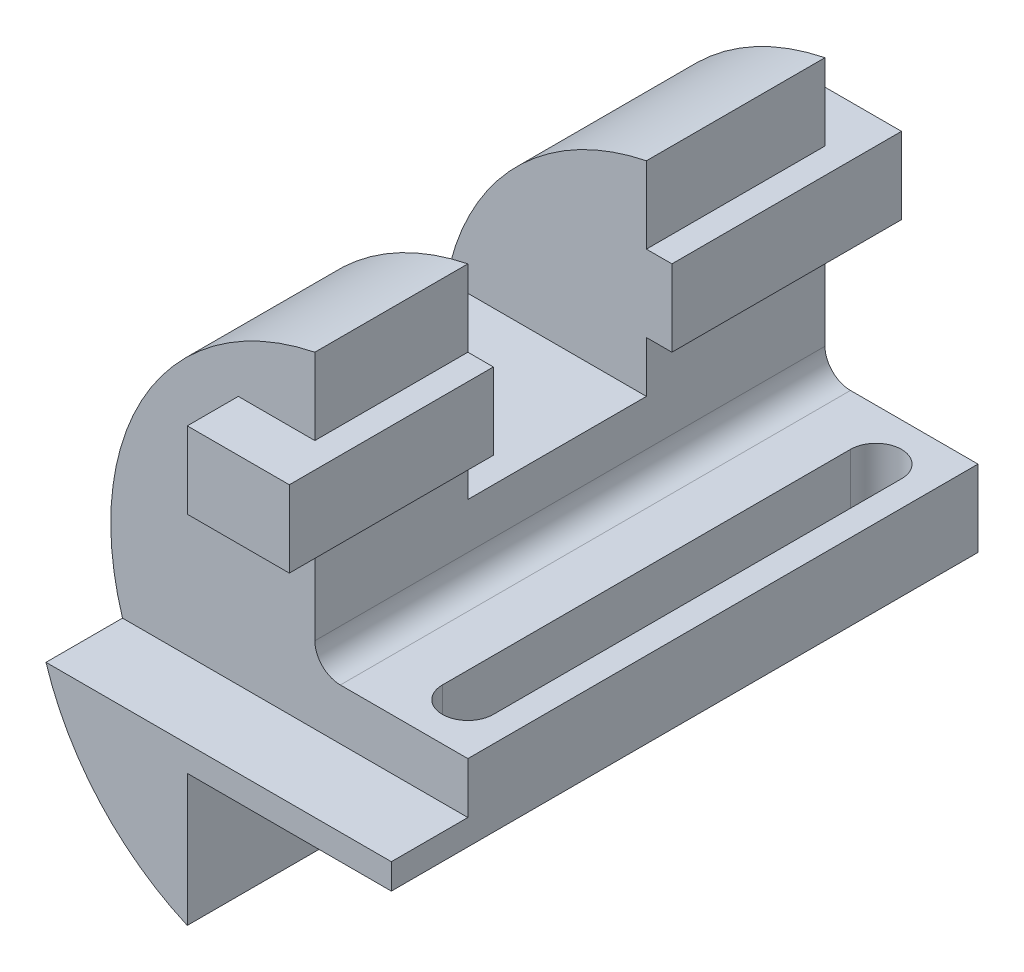
ISO-10303-21;
HEADER;
FILE_DESCRIPTION(('STEP AP214'),'2;1');
FILE_NAME('part.step','',(''),(''),'','','');
FILE_SCHEMA(('AUTOMOTIVE_DESIGN { 1 0 10303 214 1 1 1 1 }'));
ENDSEC;
DATA;
#1=APPLICATION_CONTEXT('core data for automotive mechanical design processes');
#2=APPLICATION_PROTOCOL_DEFINITION('international standard','automotive_design',2000,#1);
#3=PRODUCT_CONTEXT('',#1,'mechanical');
#4=PRODUCT('Part','Part','',(#3));
#5=PRODUCT_RELATED_PRODUCT_CATEGORY('part','',(#4));
#6=PRODUCT_DEFINITION_FORMATION('','',#4);
#7=PRODUCT_DEFINITION_CONTEXT('part definition',#1,'design');
#8=PRODUCT_DEFINITION('design','',#6,#7);
#9=PRODUCT_DEFINITION_SHAPE('','',#8);
#10=(LENGTH_UNIT() NAMED_UNIT(*) SI_UNIT(.MILLI.,.METRE.));
#11=(NAMED_UNIT(*) PLANE_ANGLE_UNIT() SI_UNIT($,.RADIAN.));
#12=(NAMED_UNIT(*) SI_UNIT($,.STERADIAN.) SOLID_ANGLE_UNIT());
#13=UNCERTAINTY_MEASURE_WITH_UNIT(LENGTH_MEASURE(1.E-05),#10,'distance_accuracy_value','');
#14=(GEOMETRIC_REPRESENTATION_CONTEXT(3) GLOBAL_UNCERTAINTY_ASSIGNED_CONTEXT((#13)) GLOBAL_UNIT_ASSIGNED_CONTEXT((#10,
#11,#12)) REPRESENTATION_CONTEXT('',''));
#15=CARTESIAN_POINT('',(0.,0.,0.));
#16=DIRECTION('',(0.,0.,1.));
#17=DIRECTION('',(1.,0.,0.));
#18=AXIS2_PLACEMENT_3D('',#15,#16,#17);
#19=CARTESIAN_POINT('',(-9.99999999999999,0.,-115.));
#20=DIRECTION('',(-1.,0.,0.));
#21=DIRECTION('',(0.,-1.,0.));
#22=AXIS2_PLACEMENT_3D('',#19,#20,#21);
#23=PLANE('',#22);
#24=DIRECTION('',(0.,0.,-1.));
#25=VECTOR('',#24,1.);
#26=CARTESIAN_POINT('',(-9.99999999999999,18.9897948556636,-115.));
#27=LINE('',#26,#25);
#28=CARTESIAN_POINT('',(-9.99999999999999,18.9897948556636,-80.));
#29=VERTEX_POINT('',#28);
#30=CARTESIAN_POINT('',(-9.99999999999999,18.9897948556636,-115.));
#31=VERTEX_POINT('',#30);
#32=EDGE_CURVE('E284',#29,#31,#27,.T.);
#33=ORIENTED_EDGE('',*,*,#32,.F.);
#34=DIRECTION('',(0.,1.,0.));
#35=VECTOR('',#34,1.);
#36=CARTESIAN_POINT('',(-9.99999999999999,48.9897948556636,-80.));
#37=LINE('',#36,#35);
#38=CARTESIAN_POINT('',(-9.99999999999999,8.98979485566356,-80.));
#39=VERTEX_POINT('',#38);
#40=EDGE_CURVE('E341',#39,#29,#37,.T.);
#41=ORIENTED_EDGE('',*,*,#40,.F.);
#42=DIRECTION('',(0.,0.,-1.));
#43=VECTOR('',#42,1.);
#44=CARTESIAN_POINT('',(-9.99999999999999,8.98979485566356,-45.));
#45=LINE('',#44,#43);
#46=CARTESIAN_POINT('',(-9.99999999999999,8.98979485566356,-45.));
#47=VERTEX_POINT('',#46);
#48=EDGE_CURVE('E337',#47,#39,#45,.T.);
#49=ORIENTED_EDGE('',*,*,#48,.F.);
#50=DIRECTION('',(0.,-1.,0.));
#51=VECTOR('',#50,1.);
#52=CARTESIAN_POINT('',(-9.99999999999999,48.9897948556636,-45.));
#53=LINE('',#52,#51);
#54=CARTESIAN_POINT('',(-9.99999999999999,18.9897948556636,-45.));
#55=VERTEX_POINT('',#54);
#56=EDGE_CURVE('E333',#55,#47,#53,.T.);
#57=ORIENTED_EDGE('',*,*,#56,.F.);
#58=DIRECTION('',(0.,0.,-1.));
#59=VECTOR('',#58,1.);
#60=CARTESIAN_POINT('',(-9.99999999999999,18.9897948556636,-115.));
#61=LINE('',#60,#59);
#62=CARTESIAN_POINT('',(-9.99999999999999,18.9897948556636,-15.));
#63=VERTEX_POINT('',#62);
#64=EDGE_CURVE('E328',#63,#55,#61,.T.);
#65=ORIENTED_EDGE('',*,*,#64,.F.);
#66=DIRECTION('',(0.,1.,0.));
#67=VECTOR('',#66,1.);
#68=CARTESIAN_POINT('',(-9.99999999999999,0.,-15.));
#69=LINE('',#68,#67);
#70=CARTESIAN_POINT('',(-9.99999999999999,0.,-15.));
#71=VERTEX_POINT('',#70);
#72=EDGE_CURVE('E357',#71,#63,#69,.T.);
#73=ORIENTED_EDGE('',*,*,#72,.F.);
#74=DIRECTION('',(0.,0.,1.));
#75=VECTOR('',#74,1.);
#76=CARTESIAN_POINT('',(-9.99999999999999,0.,-115.));
#77=LINE('',#76,#75);
#78=CARTESIAN_POINT('',(-9.99999999999999,0.,-115.));
#79=VERTEX_POINT('',#78);
#80=EDGE_CURVE('E395',#79,#71,#77,.T.);
#81=ORIENTED_EDGE('',*,*,#80,.F.);
#82=DIRECTION('',(0.,-1.,0.));
#83=VECTOR('',#82,1.);
#84=CARTESIAN_POINT('',(-9.99999999999999,0.,-115.));
#85=LINE('',#84,#83);
#86=EDGE_CURVE('E381',#31,#79,#85,.T.);
#87=ORIENTED_EDGE('',*,*,#86,.F.);
#88=EDGE_LOOP('',(#33,#41,#49,#57,#65,#73,#81,#87));
#89=FACE_BOUND('',#88,.T.);
#90=ADVANCED_FACE('F41',(#89),#23,.F.);
#91=CARTESIAN_POINT('',(-9.99999999999999,33.9897948556636,-80.));
#92=VERTEX_POINT('',#91);
#93=CARTESIAN_POINT('',(-9.99999999999999,48.9897948556636,-80.));
#94=VERTEX_POINT('',#93);
#95=EDGE_CURVE('E340',#92,#94,#37,.T.);
#96=ORIENTED_EDGE('',*,*,#95,.F.);
#97=DIRECTION('',(0.,0.,-1.));
#98=VECTOR('',#97,1.);
#99=CARTESIAN_POINT('',(-9.99999999999999,33.9897948556636,-115.));
#100=LINE('',#99,#98);
#101=CARTESIAN_POINT('',(-9.99999999999999,33.9897948556636,-115.));
#102=VERTEX_POINT('',#101);
#103=EDGE_CURVE('E289',#92,#102,#100,.T.);
#104=ORIENTED_EDGE('',*,*,#103,.T.);
#105=CARTESIAN_POINT('',(-9.99999999999999,48.9897948556636,-115.));
#106=VERTEX_POINT('',#105);
#107=EDGE_CURVE('E384',#106,#102,#85,.T.);
#108=ORIENTED_EDGE('',*,*,#107,.F.);
#109=DIRECTION('',(0.,0.,1.));
#110=VECTOR('',#109,1.);
#111=CARTESIAN_POINT('',(-9.99999999999999,48.9897948556636,-115.));
#112=LINE('',#111,#110);
#113=EDGE_CURVE('E398',#106,#94,#112,.T.);
#114=ORIENTED_EDGE('',*,*,#113,.T.);
#115=EDGE_LOOP('',(#96,#104,#108,#114));
#116=FACE_BOUND('',#115,.T.);
#117=ADVANCED_FACE('F455',(#116),#23,.F.);
#118=DIRECTION('',(0.,0.,1.));
#119=VECTOR('',#118,1.);
#120=CARTESIAN_POINT('',(-9.99999999999999,33.9897948556636,-115.));
#121=LINE('',#120,#119);
#122=CARTESIAN_POINT('',(-9.99999999999999,33.9897948556636,-45.));
#123=VERTEX_POINT('',#122);
#124=CARTESIAN_POINT('',(-9.99999999999999,33.9897948556636,-15.));
#125=VERTEX_POINT('',#124);
#126=EDGE_CURVE('E323',#123,#125,#121,.T.);
#127=ORIENTED_EDGE('',*,*,#126,.F.);
#128=CARTESIAN_POINT('',(-9.99999999999999,48.9897948556636,-45.));
#129=VERTEX_POINT('',#128);
#130=EDGE_CURVE('E334',#129,#123,#53,.T.);
#131=ORIENTED_EDGE('',*,*,#130,.F.);
#132=CARTESIAN_POINT('',(-9.99999999999999,48.9897948556636,-15.));
#133=VERTEX_POINT('',#132);
#134=EDGE_CURVE('E390',#129,#133,#112,.T.);
#135=ORIENTED_EDGE('',*,*,#134,.T.);
#136=EDGE_CURVE('E356',#125,#133,#69,.T.);
#137=ORIENTED_EDGE('',*,*,#136,.F.);
#138=EDGE_LOOP('',(#127,#131,#135,#137));
#139=FACE_BOUND('',#138,.T.);
#140=ADVANCED_FACE('F458',(#139),#23,.F.);
#141=CARTESIAN_POINT('',(0.,0.,-15.));
#142=DIRECTION('',(0.,0.,1.));
#143=DIRECTION('',(1.,0.,0.));
#144=AXIS2_PLACEMENT_3D('',#141,#142,#143);
#145=PLANE('',#144);
#146=ORIENTED_EDGE('',*,*,#72,.T.);
#147=DIRECTION('',(-1.,0.,0.));
#148=VECTOR('',#147,1.);
#149=CARTESIAN_POINT('',(0.,18.9897948556636,-15.));
#150=LINE('',#149,#148);
#151=CARTESIAN_POINT('',(-25.,18.9897948556636,-15.));
#152=VERTEX_POINT('',#151);
#153=EDGE_CURVE('E325',#63,#152,#150,.T.);
#154=ORIENTED_EDGE('',*,*,#153,.T.);
#155=DIRECTION('',(0.,1.,0.));
#156=VECTOR('',#155,1.);
#157=CARTESIAN_POINT('',(-25.,0.,-15.));
#158=LINE('',#157,#156);
#159=CARTESIAN_POINT('',(-25.,33.9897948556636,-15.));
#160=VERTEX_POINT('',#159);
#161=EDGE_CURVE('E330',#152,#160,#158,.T.);
#162=ORIENTED_EDGE('',*,*,#161,.T.);
#163=DIRECTION('',(1.,0.,0.));
#164=VECTOR('',#163,1.);
#165=CARTESIAN_POINT('',(0.,33.9897948556636,-15.));
#166=LINE('',#165,#164);
#167=EDGE_CURVE('E320',#160,#125,#166,.T.);
#168=ORIENTED_EDGE('',*,*,#167,.T.);
#169=ORIENTED_EDGE('',*,*,#136,.T.);
#170=CARTESIAN_POINT('',(0.,0.,-15.));
#171=DIRECTION('',(0.,0.,1.));
#172=DIRECTION('',(1.,0.,0.));
#173=AXIS2_PLACEMENT_3D('',#170,#171,#172);
#174=CIRCLE('',#173,50.);
#175=CARTESIAN_POINT('',(-47.6969600708473,-15.,-15.));
#176=VERTEX_POINT('',#175);
#177=EDGE_CURVE('E360',#133,#176,#174,.T.);
#178=ORIENTED_EDGE('',*,*,#177,.T.);
#179=DIRECTION('',(1.,0.,0.));
#180=VECTOR('',#179,1.);
#181=CARTESIAN_POINT('',(20.,-15.,-15.));
#182=LINE('',#181,#180);
#183=CARTESIAN_POINT('',(20.,-15.,-15.));
#184=VERTEX_POINT('',#183);
#185=EDGE_CURVE('E362',#176,#184,#182,.T.);
#186=ORIENTED_EDGE('',*,*,#185,.T.);
#187=DIRECTION('',(0.,1.,0.));
#188=VECTOR('',#187,1.);
#189=CARTESIAN_POINT('',(20.,-5.,-15.));
#190=LINE('',#189,#188);
#191=CARTESIAN_POINT('',(20.,-5.,-15.));
#192=VERTEX_POINT('',#191);
#193=EDGE_CURVE('E350',#184,#192,#190,.T.);
#194=ORIENTED_EDGE('',*,*,#193,.T.);
#195=DIRECTION('',(-1.,0.,0.));
#196=VECTOR('',#195,1.);
#197=CARTESIAN_POINT('',(20.,-5.,-15.));
#198=LINE('',#197,#196);
#199=CARTESIAN_POINT('',(-4.99999999999994,-5.,-15.));
#200=VERTEX_POINT('',#199);
#201=EDGE_CURVE('E352',#192,#200,#198,.T.);
#202=ORIENTED_EDGE('',*,*,#201,.T.);
#203=CARTESIAN_POINT('',(-5.00000000000003,0.,-15.));
#204=DIRECTION('',(0.,0.,-1.));
#205=DIRECTION('',(1.,0.,0.));
#206=AXIS2_PLACEMENT_3D('',#203,#204,#205);
#207=CIRCLE('',#206,4.99999999999996);
#208=EDGE_CURVE('E354',#200,#71,#207,.T.);
#209=ORIENTED_EDGE('',*,*,#208,.T.);
#210=EDGE_LOOP('',(#146,#154,#162,#168,#169,#178,#186,#194,#202,#209));
#211=FACE_BOUND('',#210,.T.);
#212=ADVANCED_FACE('F466',(#211),#145,.T.);
#213=CARTESIAN_POINT('',(0.,-5.,-115.));
#214=DIRECTION('',(0.,1.,0.));
#215=DIRECTION('',(-1.,0.,0.));
#216=AXIS2_PLACEMENT_3D('',#213,#214,#215);
#217=PLANE('',#216);
#218=CARTESIAN_POINT('',(9.99999999999999,-5.,-105.));
#219=DIRECTION('',(0.,1.,0.));
#220=DIRECTION('',(-1.,0.,0.));
#221=AXIS2_PLACEMENT_3D('',#218,#219,#220);
#222=CIRCLE('',#221,5.);
#223=CARTESIAN_POINT('',(15.,-5.,-105.));
#224=VERTEX_POINT('',#223);
#225=CARTESIAN_POINT('',(4.99999999999998,-5.,-105.));
#226=VERTEX_POINT('',#225);
#227=EDGE_CURVE('E56',#224,#226,#222,.T.);
#228=ORIENTED_EDGE('',*,*,#227,.F.);
#229=DIRECTION('',(0.,0.,-1.));
#230=VECTOR('',#229,1.);
#231=CARTESIAN_POINT('',(15.,-5.,-105.));
#232=LINE('',#231,#230);
#233=CARTESIAN_POINT('',(15.,-5.,-25.));
#234=VERTEX_POINT('',#233);
#235=EDGE_CURVE('E243',#234,#224,#232,.T.);
#236=ORIENTED_EDGE('',*,*,#235,.F.);
#237=CARTESIAN_POINT('',(9.99999999999999,-5.,-25.));
#238=DIRECTION('',(0.,1.,0.));
#239=DIRECTION('',(-1.,0.,0.));
#240=AXIS2_PLACEMENT_3D('',#237,#238,#239);
#241=CIRCLE('',#240,5.);
#242=CARTESIAN_POINT('',(4.99999999999999,-5.,-25.));
#243=VERTEX_POINT('',#242);
#244=EDGE_CURVE('E228',#243,#234,#241,.T.);
#245=ORIENTED_EDGE('',*,*,#244,.F.);
#246=DIRECTION('',(0.,0.,1.));
#247=VECTOR('',#246,1.);
#248=CARTESIAN_POINT('',(4.99999999999998,-5.,-105.));
#249=LINE('',#248,#247);
#250=EDGE_CURVE('E237',#226,#243,#249,.T.);
#251=ORIENTED_EDGE('',*,*,#250,.F.);
#252=EDGE_LOOP('',(#228,#236,#245,#251));
#253=FACE_BOUND('',#252,.T.);
#254=DIRECTION('',(0.,0.,1.));
#255=VECTOR('',#254,1.);
#256=CARTESIAN_POINT('',(-4.99999999999999,-5.,-115.));
#257=LINE('',#256,#255);
#258=CARTESIAN_POINT('',(-4.99999999999999,-5.,-115.));
#259=VERTEX_POINT('',#258);
#260=EDGE_CURVE('E391',#259,#200,#257,.T.);
#261=ORIENTED_EDGE('',*,*,#260,.T.);
#262=ORIENTED_EDGE('',*,*,#201,.F.);
#263=DIRECTION('',(0.,0.,1.));
#264=VECTOR('',#263,1.);
#265=CARTESIAN_POINT('',(20.,-5.,-115.));
#266=LINE('',#265,#264);
#267=CARTESIAN_POINT('',(20.,-5.,-115.));
#268=VERTEX_POINT('',#267);
#269=EDGE_CURVE('E420',#268,#192,#266,.T.);
#270=ORIENTED_EDGE('',*,*,#269,.F.);
#271=DIRECTION('',(-1.,0.,0.));
#272=VECTOR('',#271,1.);
#273=CARTESIAN_POINT('',(0.,-5.,-115.));
#274=LINE('',#273,#272);
#275=EDGE_CURVE('E401',#268,#259,#274,.T.);
#276=ORIENTED_EDGE('',*,*,#275,.T.);
#277=EDGE_LOOP('',(#261,#262,#270,#276));
#278=FACE_BOUND('',#277,.T.);
#279=ADVANCED_FACE('F43',(#253,#278),#217,.T.);
#280=CARTESIAN_POINT('',(-4.99999999999999,0.,-115.));
#281=DIRECTION('',(0.,0.,1.));
#282=DIRECTION('',(1.,0.,0.));
#283=AXIS2_PLACEMENT_3D('',#280,#281,#282);
#284=CYLINDRICAL_SURFACE('',#283,5.);
#285=ORIENTED_EDGE('',*,*,#208,.F.);
#286=ORIENTED_EDGE('',*,*,#260,.F.);
#287=CARTESIAN_POINT('',(-4.99999999999999,0.,-115.));
#288=DIRECTION('',(0.,0.,1.));
#289=DIRECTION('',(1.,0.,0.));
#290=AXIS2_PLACEMENT_3D('',#287,#288,#289);
#291=CIRCLE('',#290,5.);
#292=EDGE_CURVE('E387',#79,#259,#291,.T.);
#293=ORIENTED_EDGE('',*,*,#292,.F.);
#294=ORIENTED_EDGE('',*,*,#80,.T.);
#295=EDGE_LOOP('',(#285,#286,#293,#294));
#296=FACE_BOUND('',#295,.T.);
#297=ADVANCED_FACE('F537',(#296),#284,.F.);
#298=CARTESIAN_POINT('',(20.,-5.,-115.));
#299=DIRECTION('',(1.,0.,0.));
#300=DIRECTION('',(0.,0.,-1.));
#301=AXIS2_PLACEMENT_3D('',#298,#299,#300);
#302=PLANE('',#301);
#303=DIRECTION('',(0.,0.,1.));
#304=VECTOR('',#303,1.);
#305=CARTESIAN_POINT('',(20.,-15.,-15.));
#306=LINE('',#305,#304);
#307=CARTESIAN_POINT('',(20.,-15.,0.));
#308=VERTEX_POINT('',#307);
#309=EDGE_CURVE('E367',#184,#308,#306,.T.);
#310=ORIENTED_EDGE('',*,*,#309,.T.);
#311=DIRECTION('',(0.,1.,0.));
#312=VECTOR('',#311,1.);
#313=CARTESIAN_POINT('',(20.,-5.,0.));
#314=LINE('',#313,#312);
#315=CARTESIAN_POINT('',(20.,-20.,0.));
#316=VERTEX_POINT('',#315);
#317=EDGE_CURVE('E404',#316,#308,#314,.T.);
#318=ORIENTED_EDGE('',*,*,#317,.F.);
#319=DIRECTION('',(0.,0.,1.));
#320=VECTOR('',#319,1.);
#321=CARTESIAN_POINT('',(20.,-20.,-115.));
#322=LINE('',#321,#320);
#323=CARTESIAN_POINT('',(20.,-20.,-115.));
#324=VERTEX_POINT('',#323);
#325=EDGE_CURVE('E413',#324,#316,#322,.T.);
#326=ORIENTED_EDGE('',*,*,#325,.F.);
#327=DIRECTION('',(0.,1.,0.));
#328=VECTOR('',#327,1.);
#329=CARTESIAN_POINT('',(20.,-5.,-115.));
#330=LINE('',#329,#328);
#331=EDGE_CURVE('E410',#324,#268,#330,.T.);
#332=ORIENTED_EDGE('',*,*,#331,.T.);
#333=ORIENTED_EDGE('',*,*,#269,.T.);
#334=ORIENTED_EDGE('',*,*,#193,.F.);
#335=EDGE_LOOP('',(#310,#318,#326,#332,#333,#334));
#336=FACE_BOUND('',#335,.T.);
#337=ADVANCED_FACE('F499',(#336),#302,.T.);
#338=CARTESIAN_POINT('',(20.,-20.,-115.));
#339=DIRECTION('',(0.,-1.,0.));
#340=DIRECTION('',(1.,0.,0.));
#341=AXIS2_PLACEMENT_3D('',#338,#339,#340);
#342=PLANE('',#341);
#343=CARTESIAN_POINT('',(9.99999999999999,-20.,-105.));
#344=DIRECTION('',(0.,-1.,0.));
#345=DIRECTION('',(1.,0.,0.));
#346=AXIS2_PLACEMENT_3D('',#343,#344,#345);
#347=CIRCLE('',#346,5.);
#348=CARTESIAN_POINT('',(4.99999999999999,-20.,-105.));
#349=VERTEX_POINT('',#348);
#350=CARTESIAN_POINT('',(15.,-20.,-105.));
#351=VERTEX_POINT('',#350);
#352=EDGE_CURVE('E11',#349,#351,#347,.T.);
#353=ORIENTED_EDGE('',*,*,#352,.F.);
#354=DIRECTION('',(0.,0.,-1.));
#355=VECTOR('',#354,1.);
#356=CARTESIAN_POINT('',(4.99999999999999,-20.,-115.));
#357=LINE('',#356,#355);
#358=CARTESIAN_POINT('',(5.,-20.,-25.));
#359=VERTEX_POINT('',#358);
#360=EDGE_CURVE('E431',#359,#349,#357,.T.);
#361=ORIENTED_EDGE('',*,*,#360,.F.);
#362=CARTESIAN_POINT('',(9.99999999999999,-20.,-25.));
#363=DIRECTION('',(0.,-1.,0.));
#364=DIRECTION('',(1.,0.,0.));
#365=AXIS2_PLACEMENT_3D('',#362,#363,#364);
#366=CIRCLE('',#365,5.);
#367=CARTESIAN_POINT('',(15.,-20.,-25.));
#368=VERTEX_POINT('',#367);
#369=EDGE_CURVE('E231',#368,#359,#366,.T.);
#370=ORIENTED_EDGE('',*,*,#369,.F.);
#371=DIRECTION('',(0.,0.,1.));
#372=VECTOR('',#371,1.);
#373=CARTESIAN_POINT('',(15.,-20.,-115.));
#374=LINE('',#373,#372);
#375=EDGE_CURVE('E49',#351,#368,#374,.T.);
#376=ORIENTED_EDGE('',*,*,#375,.F.);
#377=EDGE_LOOP('',(#353,#361,#370,#376));
#378=FACE_BOUND('',#377,.T.);
#379=DIRECTION('',(1.,0.,0.));
#380=VECTOR('',#379,1.);
#381=CARTESIAN_POINT('',(20.,-20.,0.));
#382=LINE('',#381,#380);
#383=CARTESIAN_POINT('',(-20.,-20.,0.));
#384=VERTEX_POINT('',#383);
#385=EDGE_CURVE('E415',#384,#316,#382,.T.);
#386=ORIENTED_EDGE('',*,*,#385,.F.);
#387=DIRECTION('',(0.,0.,1.));
#388=VECTOR('',#387,1.);
#389=CARTESIAN_POINT('',(-20.,-20.,-115.));
#390=LINE('',#389,#388);
#391=CARTESIAN_POINT('',(-20.,-20.,-115.));
#392=VERTEX_POINT('',#391);
#393=EDGE_CURVE('E375',#392,#384,#390,.T.);
#394=ORIENTED_EDGE('',*,*,#393,.F.);
#395=DIRECTION('',(1.,0.,0.));
#396=VECTOR('',#395,1.);
#397=CARTESIAN_POINT('',(20.,-20.,-115.));
#398=LINE('',#397,#396);
#399=EDGE_CURVE('E407',#392,#324,#398,.T.);
#400=ORIENTED_EDGE('',*,*,#399,.T.);
#401=ORIENTED_EDGE('',*,*,#325,.T.);
#402=EDGE_LOOP('',(#386,#394,#400,#401));
#403=FACE_BOUND('',#402,.T.);
#404=ADVANCED_FACE('F439',(#378,#403),#342,.T.);
#405=CARTESIAN_POINT('',(0.,0.,-115.));
#406=DIRECTION('',(0.,0.,1.));
#407=DIRECTION('',(1.,0.,0.));
#408=AXIS2_PLACEMENT_3D('',#405,#406,#407);
#409=CYLINDRICAL_SURFACE('',#408,50.);
#410=CARTESIAN_POINT('',(0.,0.,-45.));
#411=DIRECTION('',(0.,0.,1.));
#412=DIRECTION('',(0.,-1.,0.));
#413=AXIS2_PLACEMENT_3D('',#410,#411,#412);
#414=CIRCLE('',#413,50.);
#415=CARTESIAN_POINT('',(-49.1851968426791,8.98979485566356,-45.));
#416=VERTEX_POINT('',#415);
#417=EDGE_CURVE('E429',#416,#129,#414,.F.);
#418=ORIENTED_EDGE('',*,*,#417,.F.);
#419=DIRECTION('',(0.,0.,1.));
#420=VECTOR('',#419,1.);
#421=CARTESIAN_POINT('',(-49.1851968426791,8.98979485566356,-115.));
#422=LINE('',#421,#420);
#423=CARTESIAN_POINT('',(-49.1851968426791,8.98979485566356,-80.));
#424=VERTEX_POINT('',#423);
#425=EDGE_CURVE('E423',#424,#416,#422,.T.);
#426=ORIENTED_EDGE('',*,*,#425,.F.);
#427=CARTESIAN_POINT('',(0.,0.,-80.));
#428=DIRECTION('',(0.,0.,-1.));
#429=DIRECTION('',(0.,1.,0.));
#430=AXIS2_PLACEMENT_3D('',#427,#428,#429);
#431=CIRCLE('',#430,50.);
#432=EDGE_CURVE('E426',#94,#424,#431,.F.);
#433=ORIENTED_EDGE('',*,*,#432,.F.);
#434=ORIENTED_EDGE('',*,*,#113,.F.);
#435=CARTESIAN_POINT('',(0.,0.,-115.));
#436=DIRECTION('',(0.,0.,1.));
#437=DIRECTION('',(1.,0.,0.));
#438=AXIS2_PLACEMENT_3D('',#435,#436,#437);
#439=CIRCLE('',#438,50.);
#440=CARTESIAN_POINT('',(-20.,-45.8257569495584,-115.));
#441=VERTEX_POINT('',#440);
#442=EDGE_CURVE('E403',#106,#441,#439,.T.);
#443=ORIENTED_EDGE('',*,*,#442,.T.);
#444=DIRECTION('',(0.,0.,1.));
#445=VECTOR('',#444,1.);
#446=CARTESIAN_POINT('',(-20.,-45.8257569495584,-115.));
#447=LINE('',#446,#445);
#448=CARTESIAN_POINT('',(-20.,-45.8257569495584,0.));
#449=VERTEX_POINT('',#448);
#450=EDGE_CURVE('E378',#441,#449,#447,.T.);
#451=ORIENTED_EDGE('',*,*,#450,.T.);
#452=CARTESIAN_POINT('',(0.,0.,0.));
#453=DIRECTION('',(0.,0.,1.));
#454=DIRECTION('',(1.,0.,0.));
#455=AXIS2_PLACEMENT_3D('',#452,#453,#454);
#456=CIRCLE('',#455,50.);
#457=CARTESIAN_POINT('',(-47.6969600708473,-15.,0.));
#458=VERTEX_POINT('',#457);
#459=EDGE_CURVE('E394',#458,#449,#456,.T.);
#460=ORIENTED_EDGE('',*,*,#459,.F.);
#461=DIRECTION('',(0.,0.,1.));
#462=VECTOR('',#461,1.);
#463=CARTESIAN_POINT('',(-47.6969600708473,-15.,-15.));
#464=LINE('',#463,#462);
#465=EDGE_CURVE('E365',#176,#458,#464,.T.);
#466=ORIENTED_EDGE('',*,*,#465,.F.);
#467=ORIENTED_EDGE('',*,*,#177,.F.);
#468=ORIENTED_EDGE('',*,*,#134,.F.);
#469=EDGE_LOOP('',(#418,#426,#433,#434,#443,#451,#460,#466,#467,#468));
#470=FACE_BOUND('',#469,.T.);
#471=ADVANCED_FACE('F487',(#470),#409,.T.);
#472=CARTESIAN_POINT('',(0.,0.,-115.));
#473=DIRECTION('',(0.,0.,1.));
#474=DIRECTION('',(1.,0.,0.));
#475=AXIS2_PLACEMENT_3D('',#472,#473,#474);
#476=PLANE('',#475);
#477=ORIENTED_EDGE('',*,*,#107,.T.);
#478=DIRECTION('',(-1.,0.,0.));
#479=VECTOR('',#478,1.);
#480=CARTESIAN_POINT('',(0.,33.9897948556636,-115.));
#481=LINE('',#480,#479);
#482=CARTESIAN_POINT('',(-25.,33.9897948556636,-115.));
#483=VERTEX_POINT('',#482);
#484=EDGE_CURVE('E287',#102,#483,#481,.T.);
#485=ORIENTED_EDGE('',*,*,#484,.T.);
#486=DIRECTION('',(0.,-1.,0.));
#487=VECTOR('',#486,1.);
#488=CARTESIAN_POINT('',(-25.,0.,-115.));
#489=LINE('',#488,#487);
#490=CARTESIAN_POINT('',(-25.,18.9897948556636,-115.));
#491=VERTEX_POINT('',#490);
#492=EDGE_CURVE('E291',#483,#491,#489,.T.);
#493=ORIENTED_EDGE('',*,*,#492,.T.);
#494=DIRECTION('',(-1.,0.,0.));
#495=VECTOR('',#494,1.);
#496=CARTESIAN_POINT('',(0.,18.9897948556636,-115.));
#497=LINE('',#496,#495);
#498=EDGE_CURVE('E281',#31,#491,#497,.T.);
#499=ORIENTED_EDGE('',*,*,#498,.F.);
#500=ORIENTED_EDGE('',*,*,#86,.T.);
#501=ORIENTED_EDGE('',*,*,#292,.T.);
#502=ORIENTED_EDGE('',*,*,#275,.F.);
#503=ORIENTED_EDGE('',*,*,#331,.F.);
#504=ORIENTED_EDGE('',*,*,#399,.F.);
#505=DIRECTION('',(0.,-1.,0.));
#506=VECTOR('',#505,1.);
#507=CARTESIAN_POINT('',(-20.,-20.,-115.));
#508=LINE('',#507,#506);
#509=EDGE_CURVE('E372',#392,#441,#508,.T.);
#510=ORIENTED_EDGE('',*,*,#509,.T.);
#511=ORIENTED_EDGE('',*,*,#442,.F.);
#512=EDGE_LOOP('',(#477,#485,#493,#499,#500,#501,#502,#503,#504,#510,#511));
#513=FACE_BOUND('',#512,.T.);
#514=ADVANCED_FACE('F509',(#513),#476,.F.);
#515=CARTESIAN_POINT('',(0.,0.,0.));
#516=DIRECTION('',(0.,0.,1.));
#517=DIRECTION('',(1.,0.,0.));
#518=AXIS2_PLACEMENT_3D('',#515,#516,#517);
#519=PLANE('',#518);
#520=DIRECTION('',(1.,0.,0.));
#521=VECTOR('',#520,1.);
#522=CARTESIAN_POINT('',(20.,-15.,0.));
#523=LINE('',#522,#521);
#524=EDGE_CURVE('E347',#458,#308,#523,.T.);
#525=ORIENTED_EDGE('',*,*,#524,.F.);
#526=ORIENTED_EDGE('',*,*,#459,.T.);
#527=DIRECTION('',(0.,-1.,0.));
#528=VECTOR('',#527,1.);
#529=CARTESIAN_POINT('',(-20.,-20.,0.));
#530=LINE('',#529,#528);
#531=EDGE_CURVE('E370',#384,#449,#530,.T.);
#532=ORIENTED_EDGE('',*,*,#531,.F.);
#533=ORIENTED_EDGE('',*,*,#385,.T.);
#534=ORIENTED_EDGE('',*,*,#317,.T.);
#535=EDGE_LOOP('',(#525,#526,#532,#533,#534));
#536=FACE_BOUND('',#535,.T.);
#537=ADVANCED_FACE('F501',(#536),#519,.T.);
#538=CARTESIAN_POINT('',(-20.,-20.,-115.));
#539=DIRECTION('',(-1.,0.,0.));
#540=DIRECTION('',(0.,0.,1.));
#541=AXIS2_PLACEMENT_3D('',#538,#539,#540);
#542=PLANE('',#541);
#543=ORIENTED_EDGE('',*,*,#531,.T.);
#544=ORIENTED_EDGE('',*,*,#450,.F.);
#545=ORIENTED_EDGE('',*,*,#509,.F.);
#546=ORIENTED_EDGE('',*,*,#393,.T.);
#547=EDGE_LOOP('',(#543,#544,#545,#546));
#548=FACE_BOUND('',#547,.T.);
#549=ADVANCED_FACE('F506',(#548),#542,.F.);
#550=CARTESIAN_POINT('',(20.,-15.,-15.));
#551=DIRECTION('',(0.,-1.,0.));
#552=DIRECTION('',(1.,0.,0.));
#553=AXIS2_PLACEMENT_3D('',#550,#551,#552);
#554=PLANE('',#553);
#555=ORIENTED_EDGE('',*,*,#524,.T.);
#556=ORIENTED_EDGE('',*,*,#309,.F.);
#557=ORIENTED_EDGE('',*,*,#185,.F.);
#558=ORIENTED_EDGE('',*,*,#465,.T.);
#559=EDGE_LOOP('',(#555,#556,#557,#558));
#560=FACE_BOUND('',#559,.T.);
#561=ADVANCED_FACE('F495',(#560),#554,.F.);
#562=CARTESIAN_POINT('',(-65.,48.9897948556636,-45.));
#563=DIRECTION('',(0.,0.,1.));
#564=DIRECTION('',(0.,-1.,0.));
#565=AXIS2_PLACEMENT_3D('',#562,#563,#564);
#566=PLANE('',#565);
#567=ORIENTED_EDGE('',*,*,#130,.T.);
#568=DIRECTION('',(-1.,0.,0.));
#569=VECTOR('',#568,1.);
#570=CARTESIAN_POINT('',(-25.,33.9897948556636,-45.));
#571=LINE('',#570,#569);
#572=CARTESIAN_POINT('',(-4.99999999999999,33.9897948556636,-45.));
#573=VERTEX_POINT('',#572);
#574=EDGE_CURVE('E298',#573,#123,#571,.T.);
#575=ORIENTED_EDGE('',*,*,#574,.F.);
#576=DIRECTION('',(0.,1.,0.));
#577=VECTOR('',#576,1.);
#578=CARTESIAN_POINT('',(-4.99999999999999,33.9897948556636,-45.));
#579=LINE('',#578,#577);
#580=CARTESIAN_POINT('',(-4.99999999999999,18.9897948556636,-45.));
#581=VERTEX_POINT('',#580);
#582=EDGE_CURVE('E295',#581,#573,#579,.T.);
#583=ORIENTED_EDGE('',*,*,#582,.F.);
#584=DIRECTION('',(1.,0.,0.));
#585=VECTOR('',#584,1.);
#586=CARTESIAN_POINT('',(-25.,18.9897948556636,-45.));
#587=LINE('',#586,#585);
#588=EDGE_CURVE('E293',#55,#581,#587,.T.);
#589=ORIENTED_EDGE('',*,*,#588,.F.);
#590=ORIENTED_EDGE('',*,*,#56,.T.);
#591=DIRECTION('',(1.,0.,0.));
#592=VECTOR('',#591,1.);
#593=CARTESIAN_POINT('',(-65.,8.98979485566356,-45.));
#594=LINE('',#593,#592);
#595=EDGE_CURVE('E344',#416,#47,#594,.T.);
#596=ORIENTED_EDGE('',*,*,#595,.F.);
#597=ORIENTED_EDGE('',*,*,#417,.T.);
#598=EDGE_LOOP('',(#567,#575,#583,#589,#590,#596,#597));
#599=FACE_BOUND('',#598,.T.);
#600=ADVANCED_FACE('F481',(#599),#566,.F.);
#601=CARTESIAN_POINT('',(-65.,48.9897948556636,-80.));
#602=DIRECTION('',(0.,0.,-1.));
#603=DIRECTION('',(0.,1.,0.));
#604=AXIS2_PLACEMENT_3D('',#601,#602,#603);
#605=PLANE('',#604);
#606=ORIENTED_EDGE('',*,*,#40,.T.);
#607=DIRECTION('',(-1.,0.,0.));
#608=VECTOR('',#607,1.);
#609=CARTESIAN_POINT('',(0.,18.9897948556636,-80.));
#610=LINE('',#609,#608);
#611=CARTESIAN_POINT('',(-4.99999999999999,18.9897948556636,-80.));
#612=VERTEX_POINT('',#611);
#613=EDGE_CURVE('E258',#612,#29,#610,.T.);
#614=ORIENTED_EDGE('',*,*,#613,.F.);
#615=DIRECTION('',(0.,-1.,0.));
#616=VECTOR('',#615,1.);
#617=CARTESIAN_POINT('',(-4.99999999999999,0.,-80.));
#618=LINE('',#617,#616);
#619=CARTESIAN_POINT('',(-4.99999999999999,33.9897948556636,-80.));
#620=VERTEX_POINT('',#619);
#621=EDGE_CURVE('E255',#620,#612,#618,.T.);
#622=ORIENTED_EDGE('',*,*,#621,.F.);
#623=DIRECTION('',(-1.,0.,0.));
#624=VECTOR('',#623,1.);
#625=CARTESIAN_POINT('',(0.,33.9897948556636,-80.));
#626=LINE('',#625,#624);
#627=EDGE_CURVE('E250',#620,#92,#626,.T.);
#628=ORIENTED_EDGE('',*,*,#627,.T.);
#629=ORIENTED_EDGE('',*,*,#95,.T.);
#630=ORIENTED_EDGE('',*,*,#432,.T.);
#631=DIRECTION('',(1.,0.,0.));
#632=VECTOR('',#631,1.);
#633=CARTESIAN_POINT('',(-65.,8.98979485566356,-80.));
#634=LINE('',#633,#632);
#635=EDGE_CURVE('E345',#424,#39,#634,.T.);
#636=ORIENTED_EDGE('',*,*,#635,.T.);
#637=EDGE_LOOP('',(#606,#614,#622,#628,#629,#630,#636));
#638=FACE_BOUND('',#637,.T.);
#639=ADVANCED_FACE('F549',(#638),#605,.F.);
#640=CARTESIAN_POINT('',(-65.,8.98979485566356,-45.));
#641=DIRECTION('',(0.,-1.,0.));
#642=DIRECTION('',(1.,0.,0.));
#643=AXIS2_PLACEMENT_3D('',#640,#641,#642);
#644=PLANE('',#643);
#645=ORIENTED_EDGE('',*,*,#425,.T.);
#646=ORIENTED_EDGE('',*,*,#595,.T.);
#647=ORIENTED_EDGE('',*,*,#48,.T.);
#648=ORIENTED_EDGE('',*,*,#635,.F.);
#649=EDGE_LOOP('',(#645,#646,#647,#648));
#650=FACE_BOUND('',#649,.T.);
#651=ADVANCED_FACE('F547',(#650),#644,.F.);
#652=CARTESIAN_POINT('',(-25.,18.9897948556636,-5.));
#653=DIRECTION('',(0.,1.,0.));
#654=DIRECTION('',(0.,0.,1.));
#655=AXIS2_PLACEMENT_3D('',#652,#653,#654);
#656=PLANE('',#655);
#657=ORIENTED_EDGE('',*,*,#153,.F.);
#658=ORIENTED_EDGE('',*,*,#64,.T.);
#659=ORIENTED_EDGE('',*,*,#588,.T.);
#660=DIRECTION('',(0.,0.,-1.));
#661=VECTOR('',#660,1.);
#662=CARTESIAN_POINT('',(-4.99999999999999,18.9897948556636,-5.));
#663=LINE('',#662,#661);
#664=CARTESIAN_POINT('',(-4.99999999999999,18.9897948556636,-5.));
#665=VERTEX_POINT('',#664);
#666=EDGE_CURVE('E314',#665,#581,#663,.T.);
#667=ORIENTED_EDGE('',*,*,#666,.F.);
#668=DIRECTION('',(1.,0.,0.));
#669=VECTOR('',#668,1.);
#670=CARTESIAN_POINT('',(-25.,18.9897948556636,-5.));
#671=LINE('',#670,#669);
#672=CARTESIAN_POINT('',(-25.,18.9897948556636,-5.));
#673=VERTEX_POINT('',#672);
#674=EDGE_CURVE('E303',#673,#665,#671,.T.);
#675=ORIENTED_EDGE('',*,*,#674,.F.);
#676=DIRECTION('',(0.,0.,-1.));
#677=VECTOR('',#676,1.);
#678=CARTESIAN_POINT('',(-25.,18.9897948556636,-5.));
#679=LINE('',#678,#677);
#680=EDGE_CURVE('E317',#673,#152,#679,.T.);
#681=ORIENTED_EDGE('',*,*,#680,.T.);
#682=EDGE_LOOP('',(#657,#658,#659,#667,#675,#681));
#683=FACE_BOUND('',#682,.T.);
#684=ADVANCED_FACE('F541',(#683),#656,.F.);
#685=CARTESIAN_POINT('',(-25.,33.9897948556636,-5.));
#686=DIRECTION('',(0.,-1.,0.));
#687=DIRECTION('',(0.,0.,-1.));
#688=AXIS2_PLACEMENT_3D('',#685,#686,#687);
#689=PLANE('',#688);
#690=ORIENTED_EDGE('',*,*,#574,.T.);
#691=ORIENTED_EDGE('',*,*,#126,.T.);
#692=ORIENTED_EDGE('',*,*,#167,.F.);
#693=DIRECTION('',(0.,0.,-1.));
#694=VECTOR('',#693,1.);
#695=CARTESIAN_POINT('',(-25.,33.9897948556636,-5.));
#696=LINE('',#695,#694);
#697=CARTESIAN_POINT('',(-25.,33.9897948556636,-5.));
#698=VERTEX_POINT('',#697);
#699=EDGE_CURVE('E309',#698,#160,#696,.T.);
#700=ORIENTED_EDGE('',*,*,#699,.F.);
#701=DIRECTION('',(-1.,0.,0.));
#702=VECTOR('',#701,1.);
#703=CARTESIAN_POINT('',(-25.,33.9897948556636,-5.));
#704=LINE('',#703,#702);
#705=CARTESIAN_POINT('',(-4.99999999999999,33.9897948556636,-5.));
#706=VERTEX_POINT('',#705);
#707=EDGE_CURVE('E307',#706,#698,#704,.T.);
#708=ORIENTED_EDGE('',*,*,#707,.F.);
#709=DIRECTION('',(0.,0.,-1.));
#710=VECTOR('',#709,1.);
#711=CARTESIAN_POINT('',(-4.99999999999999,33.9897948556636,-5.));
#712=LINE('',#711,#710);
#713=EDGE_CURVE('E312',#706,#573,#712,.T.);
#714=ORIENTED_EDGE('',*,*,#713,.T.);
#715=EDGE_LOOP('',(#690,#691,#692,#700,#708,#714));
#716=FACE_BOUND('',#715,.T.);
#717=ADVANCED_FACE('F569',(#716),#689,.F.);
#718=CARTESIAN_POINT('',(-25.,33.9897948556636,-5.));
#719=DIRECTION('',(1.,0.,0.));
#720=DIRECTION('',(0.,1.,0.));
#721=AXIS2_PLACEMENT_3D('',#718,#719,#720);
#722=PLANE('',#721);
#723=ORIENTED_EDGE('',*,*,#161,.F.);
#724=ORIENTED_EDGE('',*,*,#680,.F.);
#725=DIRECTION('',(0.,-1.,0.));
#726=VECTOR('',#725,1.);
#727=CARTESIAN_POINT('',(-25.,33.9897948556636,-5.));
#728=LINE('',#727,#726);
#729=EDGE_CURVE('E300',#698,#673,#728,.T.);
#730=ORIENTED_EDGE('',*,*,#729,.F.);
#731=ORIENTED_EDGE('',*,*,#699,.T.);
#732=EDGE_LOOP('',(#723,#724,#730,#731));
#733=FACE_BOUND('',#732,.T.);
#734=ADVANCED_FACE('F572',(#733),#722,.F.);
#735=CARTESIAN_POINT('',(-4.99999999999999,33.9897948556636,-5.));
#736=DIRECTION('',(-1.,0.,0.));
#737=DIRECTION('',(0.,0.,1.));
#738=AXIS2_PLACEMENT_3D('',#735,#736,#737);
#739=PLANE('',#738);
#740=ORIENTED_EDGE('',*,*,#666,.T.);
#741=ORIENTED_EDGE('',*,*,#582,.T.);
#742=ORIENTED_EDGE('',*,*,#713,.F.);
#743=DIRECTION('',(0.,1.,0.));
#744=VECTOR('',#743,1.);
#745=CARTESIAN_POINT('',(-4.99999999999999,33.9897948556636,-5.));
#746=LINE('',#745,#744);
#747=EDGE_CURVE('E305',#665,#706,#746,.T.);
#748=ORIENTED_EDGE('',*,*,#747,.F.);
#749=EDGE_LOOP('',(#740,#741,#742,#748));
#750=FACE_BOUND('',#749,.T.);
#751=ADVANCED_FACE('F567',(#750),#739,.F.);
#752=CARTESIAN_POINT('',(0.,0.,-5.));
#753=DIRECTION('',(0.,0.,1.));
#754=DIRECTION('',(1.,0.,0.));
#755=AXIS2_PLACEMENT_3D('',#752,#753,#754);
#756=PLANE('',#755);
#757=ORIENTED_EDGE('',*,*,#729,.T.);
#758=ORIENTED_EDGE('',*,*,#674,.T.);
#759=ORIENTED_EDGE('',*,*,#747,.T.);
#760=ORIENTED_EDGE('',*,*,#707,.T.);
#761=EDGE_LOOP('',(#757,#758,#759,#760));
#762=FACE_BOUND('',#761,.T.);
#763=ADVANCED_FACE('F564',(#762),#756,.T.);
#764=CARTESIAN_POINT('',(-25.,0.,-125.));
#765=DIRECTION('',(-1.,0.,0.));
#766=DIRECTION('',(0.,0.,1.));
#767=AXIS2_PLACEMENT_3D('',#764,#765,#766);
#768=PLANE('',#767);
#769=ORIENTED_EDGE('',*,*,#492,.F.);
#770=DIRECTION('',(0.,0.,1.));
#771=VECTOR('',#770,1.);
#772=CARTESIAN_POINT('',(-25.,33.9897948556636,-125.));
#773=LINE('',#772,#771);
#774=CARTESIAN_POINT('',(-25.,33.9897948556636,-125.));
#775=VERTEX_POINT('',#774);
#776=EDGE_CURVE('E278',#775,#483,#773,.T.);
#777=ORIENTED_EDGE('',*,*,#776,.F.);
#778=DIRECTION('',(0.,-1.,0.));
#779=VECTOR('',#778,1.);
#780=CARTESIAN_POINT('',(-25.,0.,-125.));
#781=LINE('',#780,#779);
#782=CARTESIAN_POINT('',(-25.,18.9897948556636,-125.));
#783=VERTEX_POINT('',#782);
#784=EDGE_CURVE('E261',#775,#783,#781,.T.);
#785=ORIENTED_EDGE('',*,*,#784,.T.);
#786=DIRECTION('',(0.,0.,1.));
#787=VECTOR('',#786,1.);
#788=CARTESIAN_POINT('',(-25.,18.9897948556636,-125.));
#789=LINE('',#788,#787);
#790=EDGE_CURVE('E271',#783,#491,#789,.T.);
#791=ORIENTED_EDGE('',*,*,#790,.T.);
#792=EDGE_LOOP('',(#769,#777,#785,#791));
#793=FACE_BOUND('',#792,.T.);
#794=ADVANCED_FACE('F521',(#793),#768,.T.);
#795=CARTESIAN_POINT('',(0.,33.9897948556636,-125.));
#796=DIRECTION('',(0.,1.,0.));
#797=DIRECTION('',(0.,0.,1.));
#798=AXIS2_PLACEMENT_3D('',#795,#796,#797);
#799=PLANE('',#798);
#800=ORIENTED_EDGE('',*,*,#103,.F.);
#801=ORIENTED_EDGE('',*,*,#627,.F.);
#802=DIRECTION('',(0.,0.,1.));
#803=VECTOR('',#802,1.);
#804=CARTESIAN_POINT('',(-4.99999999999999,33.9897948556636,-125.));
#805=LINE('',#804,#803);
#806=CARTESIAN_POINT('',(-4.99999999999999,33.9897948556636,-125.));
#807=VERTEX_POINT('',#806);
#808=EDGE_CURVE('E276',#807,#620,#805,.T.);
#809=ORIENTED_EDGE('',*,*,#808,.F.);
#810=DIRECTION('',(-1.,0.,0.));
#811=VECTOR('',#810,1.);
#812=CARTESIAN_POINT('',(0.,33.9897948556636,-125.));
#813=LINE('',#812,#811);
#814=EDGE_CURVE('E264',#807,#775,#813,.T.);
#815=ORIENTED_EDGE('',*,*,#814,.T.);
#816=ORIENTED_EDGE('',*,*,#776,.T.);
#817=ORIENTED_EDGE('',*,*,#484,.F.);
#818=EDGE_LOOP('',(#800,#801,#809,#815,#816,#817));
#819=FACE_BOUND('',#818,.T.);
#820=ADVANCED_FACE('F516',(#819),#799,.T.);
#821=CARTESIAN_POINT('',(0.,18.9897948556636,-125.));
#822=DIRECTION('',(0.,1.,0.));
#823=DIRECTION('',(0.,0.,1.));
#824=AXIS2_PLACEMENT_3D('',#821,#822,#823);
#825=PLANE('',#824);
#826=ORIENTED_EDGE('',*,*,#613,.T.);
#827=ORIENTED_EDGE('',*,*,#32,.T.);
#828=ORIENTED_EDGE('',*,*,#498,.T.);
#829=ORIENTED_EDGE('',*,*,#790,.F.);
#830=DIRECTION('',(-1.,0.,0.));
#831=VECTOR('',#830,1.);
#832=CARTESIAN_POINT('',(0.,18.9897948556636,-125.));
#833=LINE('',#832,#831);
#834=CARTESIAN_POINT('',(-4.99999999999999,18.9897948556636,-125.));
#835=VERTEX_POINT('',#834);
#836=EDGE_CURVE('E269',#835,#783,#833,.T.);
#837=ORIENTED_EDGE('',*,*,#836,.F.);
#838=DIRECTION('',(0.,0.,1.));
#839=VECTOR('',#838,1.);
#840=CARTESIAN_POINT('',(-4.99999999999999,18.9897948556636,-125.));
#841=LINE('',#840,#839);
#842=EDGE_CURVE('E274',#835,#612,#841,.T.);
#843=ORIENTED_EDGE('',*,*,#842,.T.);
#844=EDGE_LOOP('',(#826,#827,#828,#829,#837,#843));
#845=FACE_BOUND('',#844,.T.);
#846=ADVANCED_FACE('F527',(#845),#825,.F.);
#847=CARTESIAN_POINT('',(-4.99999999999999,0.,-125.));
#848=DIRECTION('',(-1.,0.,0.));
#849=DIRECTION('',(0.,0.,1.));
#850=AXIS2_PLACEMENT_3D('',#847,#848,#849);
#851=PLANE('',#850);
#852=ORIENTED_EDGE('',*,*,#808,.T.);
#853=ORIENTED_EDGE('',*,*,#621,.T.);
#854=ORIENTED_EDGE('',*,*,#842,.F.);
#855=DIRECTION('',(0.,-1.,0.));
#856=VECTOR('',#855,1.);
#857=CARTESIAN_POINT('',(-4.99999999999999,0.,-125.));
#858=LINE('',#857,#856);
#859=EDGE_CURVE('E267',#807,#835,#858,.T.);
#860=ORIENTED_EDGE('',*,*,#859,.F.);
#861=EDGE_LOOP('',(#852,#853,#854,#860));
#862=FACE_BOUND('',#861,.T.);
#863=ADVANCED_FACE('F450',(#862),#851,.F.);
#864=CARTESIAN_POINT('',(0.,0.,-125.));
#865=DIRECTION('',(0.,0.,-1.));
#866=DIRECTION('',(-1.,0.,0.));
#867=AXIS2_PLACEMENT_3D('',#864,#865,#866);
#868=PLANE('',#867);
#869=ORIENTED_EDGE('',*,*,#784,.F.);
#870=ORIENTED_EDGE('',*,*,#814,.F.);
#871=ORIENTED_EDGE('',*,*,#859,.T.);
#872=ORIENTED_EDGE('',*,*,#836,.T.);
#873=EDGE_LOOP('',(#869,#870,#871,#872));
#874=FACE_BOUND('',#873,.T.);
#875=ADVANCED_FACE('F443',(#874),#868,.T.);
#876=CARTESIAN_POINT('',(10.,-40.,-105.));
#877=DIRECTION('',(0.,1.,0.));
#878=DIRECTION('',(-1.,0.,0.));
#879=AXIS2_PLACEMENT_3D('',#876,#877,#878);
#880=CYLINDRICAL_SURFACE('',#879,5.);
#881=ORIENTED_EDGE('',*,*,#352,.T.);
#882=DIRECTION('',(0.,1.,0.));
#883=VECTOR('',#882,1.);
#884=CARTESIAN_POINT('',(15.,-40.,-105.));
#885=LINE('',#884,#883);
#886=EDGE_CURVE('E248',#351,#224,#885,.T.);
#887=ORIENTED_EDGE('',*,*,#886,.T.);
#888=ORIENTED_EDGE('',*,*,#227,.T.);
#889=DIRECTION('',(0.,1.,0.));
#890=VECTOR('',#889,1.);
#891=CARTESIAN_POINT('',(4.99999999999999,-40.,-105.));
#892=LINE('',#891,#890);
#893=EDGE_CURVE('E234',#349,#226,#892,.T.);
#894=ORIENTED_EDGE('',*,*,#893,.F.);
#895=EDGE_LOOP('',(#881,#887,#888,#894));
#896=FACE_BOUND('',#895,.T.);
#897=ADVANCED_FACE('F441',(#896),#880,.F.);
#898=CARTESIAN_POINT('',(15.,-40.,-105.));
#899=DIRECTION('',(1.,0.,0.));
#900=DIRECTION('',(0.,1.,0.));
#901=AXIS2_PLACEMENT_3D('',#898,#899,#900);
#902=PLANE('',#901);
#903=ORIENTED_EDGE('',*,*,#375,.T.);
#904=DIRECTION('',(0.,1.,0.));
#905=VECTOR('',#904,1.);
#906=CARTESIAN_POINT('',(15.,-40.,-25.));
#907=LINE('',#906,#905);
#908=EDGE_CURVE('E233',#368,#234,#907,.T.);
#909=ORIENTED_EDGE('',*,*,#908,.T.);
#910=ORIENTED_EDGE('',*,*,#235,.T.);
#911=ORIENTED_EDGE('',*,*,#886,.F.);
#912=EDGE_LOOP('',(#903,#909,#910,#911));
#913=FACE_BOUND('',#912,.T.);
#914=ADVANCED_FACE('F436',(#913),#902,.F.);
#915=CARTESIAN_POINT('',(10.,-40.,-25.));
#916=DIRECTION('',(0.,1.,0.));
#917=DIRECTION('',(-1.,0.,0.));
#918=AXIS2_PLACEMENT_3D('',#915,#916,#917);
#919=CYLINDRICAL_SURFACE('',#918,5.);
#920=ORIENTED_EDGE('',*,*,#369,.T.);
#921=DIRECTION('',(0.,1.,0.));
#922=VECTOR('',#921,1.);
#923=CARTESIAN_POINT('',(5.,-40.,-25.));
#924=LINE('',#923,#922);
#925=EDGE_CURVE('E64',#359,#243,#924,.T.);
#926=ORIENTED_EDGE('',*,*,#925,.T.);
#927=ORIENTED_EDGE('',*,*,#244,.T.);
#928=ORIENTED_EDGE('',*,*,#908,.F.);
#929=EDGE_LOOP('',(#920,#926,#927,#928));
#930=FACE_BOUND('',#929,.T.);
#931=ADVANCED_FACE('F225',(#930),#919,.F.);
#932=CARTESIAN_POINT('',(4.99999999999999,-40.,-105.));
#933=DIRECTION('',(-1.,0.,0.));
#934=DIRECTION('',(0.,-1.,0.));
#935=AXIS2_PLACEMENT_3D('',#932,#933,#934);
#936=PLANE('',#935);
#937=ORIENTED_EDGE('',*,*,#360,.T.);
#938=ORIENTED_EDGE('',*,*,#893,.T.);
#939=ORIENTED_EDGE('',*,*,#250,.T.);
#940=ORIENTED_EDGE('',*,*,#925,.F.);
#941=EDGE_LOOP('',(#937,#938,#939,#940));
#942=FACE_BOUND('',#941,.T.);
#943=ADVANCED_FACE('F238',(#942),#936,.F.);
#944=CLOSED_SHELL('',(#90,#117,#140,#212,#279,#297,#337,#404,#471,#514,#537,#549,#561,#600,#639,
#651,#684,#717,#734,#751,#763,#794,#820,#846,#863,#875,#897,#914,#931,#943));
#945=MANIFOLD_SOLID_BREP('B2',#944);
#946=ADVANCED_BREP_SHAPE_REPRESENTATION('',(#18,#945),#14);
#947=SHAPE_DEFINITION_REPRESENTATION(#9,#946);
ENDSEC;
END-ISO-10303-21;
